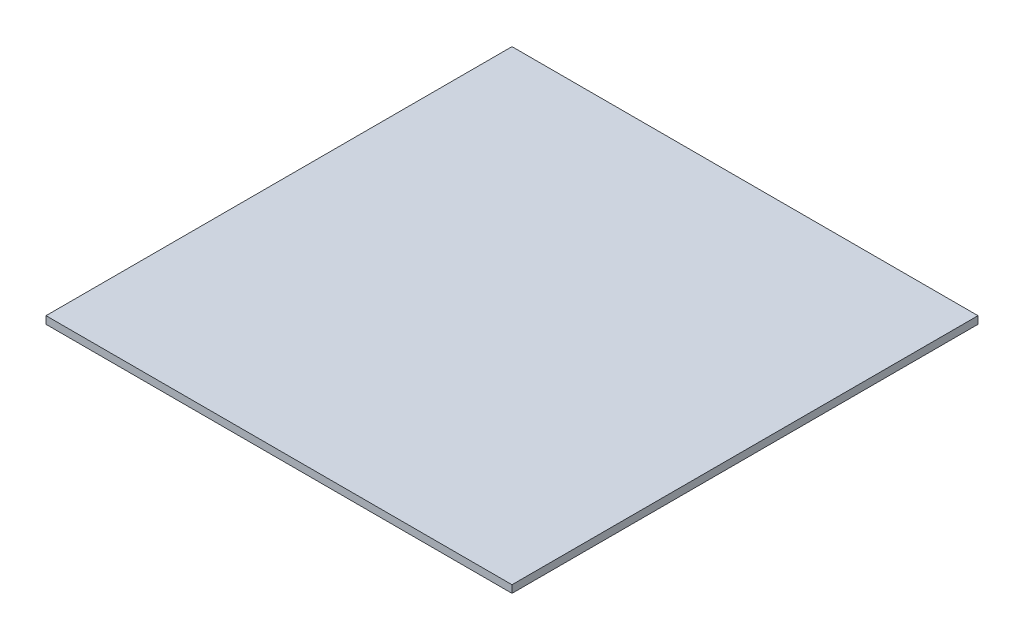
ISO-10303-21;
HEADER;
FILE_DESCRIPTION(('STEP AP214'),'2;1');
FILE_NAME('part.step','',(''),(''),'','','');
FILE_SCHEMA(('AUTOMOTIVE_DESIGN { 1 0 10303 214 1 1 1 1 }'));
ENDSEC;
DATA;
#1=APPLICATION_CONTEXT('core data for automotive mechanical design processes');
#2=APPLICATION_PROTOCOL_DEFINITION('international standard','automotive_design',2000,#1);
#3=PRODUCT_CONTEXT('',#1,'mechanical');
#4=PRODUCT('Part','Part','',(#3));
#5=PRODUCT_RELATED_PRODUCT_CATEGORY('part','',(#4));
#6=PRODUCT_DEFINITION_FORMATION('','',#4);
#7=PRODUCT_DEFINITION_CONTEXT('part definition',#1,'design');
#8=PRODUCT_DEFINITION('design','',#6,#7);
#9=PRODUCT_DEFINITION_SHAPE('','',#8);
#10=(LENGTH_UNIT() NAMED_UNIT(*) SI_UNIT(.MILLI.,.METRE.));
#11=(NAMED_UNIT(*) PLANE_ANGLE_UNIT() SI_UNIT($,.RADIAN.));
#12=(NAMED_UNIT(*) SI_UNIT($,.STERADIAN.) SOLID_ANGLE_UNIT());
#13=UNCERTAINTY_MEASURE_WITH_UNIT(LENGTH_MEASURE(1.E-05),#10,'distance_accuracy_value','');
#14=(GEOMETRIC_REPRESENTATION_CONTEXT(3) GLOBAL_UNCERTAINTY_ASSIGNED_CONTEXT((#13)) GLOBAL_UNIT_ASSIGNED_CONTEXT((#10,
#11,#12)) REPRESENTATION_CONTEXT('',''));
#15=CARTESIAN_POINT('',(0.,0.,0.));
#16=DIRECTION('',(0.,0.,1.));
#17=DIRECTION('',(1.,0.,0.));
#18=AXIS2_PLACEMENT_3D('',#15,#16,#17);
#19=CARTESIAN_POINT('',(1.55,0.,-1.55));
#20=DIRECTION('',(0.,-1.,0.));
#21=DIRECTION('',(0.,0.,-1.));
#22=AXIS2_PLACEMENT_3D('',#19,#20,#21);
#23=PLANE('',#22);
#24=DIRECTION('',(0.,0.,-1.));
#25=VECTOR('',#24,1.);
#26=CARTESIAN_POINT('',(-1.55,0.,1.55));
#27=LINE('',#26,#25);
#28=CARTESIAN_POINT('',(-1.55,0.,1.55));
#29=VERTEX_POINT('',#28);
#30=CARTESIAN_POINT('',(-1.55,0.,-1.55));
#31=VERTEX_POINT('',#30);
#32=EDGE_CURVE('E19',#29,#31,#27,.T.);
#33=ORIENTED_EDGE('',*,*,#32,.T.);
#34=DIRECTION('',(1.,0.,0.));
#35=VECTOR('',#34,1.);
#36=CARTESIAN_POINT('',(-1.55,0.,-1.55));
#37=LINE('',#36,#35);
#38=CARTESIAN_POINT('',(1.55,0.,-1.55));
#39=VERTEX_POINT('',#38);
#40=EDGE_CURVE('E54',#31,#39,#37,.T.);
#41=ORIENTED_EDGE('',*,*,#40,.T.);
#42=DIRECTION('',(0.,0.,1.));
#43=VECTOR('',#42,1.);
#44=CARTESIAN_POINT('',(1.55,0.,1.55));
#45=LINE('',#44,#43);
#46=CARTESIAN_POINT('',(1.55,0.,1.55));
#47=VERTEX_POINT('',#46);
#48=EDGE_CURVE('E75',#39,#47,#45,.T.);
#49=ORIENTED_EDGE('',*,*,#48,.T.);
#50=DIRECTION('',(-1.,0.,0.));
#51=VECTOR('',#50,1.);
#52=CARTESIAN_POINT('',(-1.55,0.,1.55));
#53=LINE('',#52,#51);
#54=EDGE_CURVE('E57',#47,#29,#53,.T.);
#55=ORIENTED_EDGE('',*,*,#54,.T.);
#56=EDGE_LOOP('',(#33,#41,#49,#55));
#57=FACE_BOUND('',#56,.T.);
#58=ADVANCED_FACE('F16',(#57),#23,.T.);
#59=CARTESIAN_POINT('',(-1.55,500000.,1.55));
#60=DIRECTION('',(1.,0.,0.));
#61=DIRECTION('',(0.,0.,-1.));
#62=AXIS2_PLACEMENT_3D('',#59,#60,#61);
#63=PLANE('',#62);
#64=ORIENTED_EDGE('',*,*,#32,.F.);
#65=DIRECTION('',(0.,1.,0.));
#66=VECTOR('',#65,1.);
#67=CARTESIAN_POINT('',(-1.55,500000.,1.55));
#68=LINE('',#67,#66);
#69=CARTESIAN_POINT('',(-1.55,0.0500000000332193,1.55));
#70=VERTEX_POINT('',#69);
#71=EDGE_CURVE('E79',#29,#70,#68,.T.);
#72=ORIENTED_EDGE('',*,*,#71,.T.);
#73=DIRECTION('',(0.,0.,-1.));
#74=VECTOR('',#73,1.);
#75=CARTESIAN_POINT('',(-1.55,0.05,-2.5));
#76=LINE('',#75,#74);
#77=CARTESIAN_POINT('',(-1.55,0.0500000000332193,-1.55));
#78=VERTEX_POINT('',#77);
#79=EDGE_CURVE('E72',#70,#78,#76,.T.);
#80=ORIENTED_EDGE('',*,*,#79,.T.);
#81=DIRECTION('',(0.,1.,0.));
#82=VECTOR('',#81,1.);
#83=CARTESIAN_POINT('',(-1.55,500000.,-1.55));
#84=LINE('',#83,#82);
#85=EDGE_CURVE('E62',#78,#31,#84,.F.);
#86=ORIENTED_EDGE('',*,*,#85,.T.);
#87=EDGE_LOOP('',(#64,#72,#80,#86));
#88=FACE_BOUND('',#87,.T.);
#89=ADVANCED_FACE('F71',(#88),#63,.F.);
#90=CARTESIAN_POINT('',(-1.55,500000.,-1.55));
#91=DIRECTION('',(0.,0.,1.));
#92=DIRECTION('',(1.,0.,0.));
#93=AXIS2_PLACEMENT_3D('',#90,#91,#92);
#94=PLANE('',#93);
#95=ORIENTED_EDGE('',*,*,#40,.F.);
#96=ORIENTED_EDGE('',*,*,#85,.F.);
#97=DIRECTION('',(1.,0.,0.));
#98=VECTOR('',#97,1.);
#99=CARTESIAN_POINT('',(2.5,0.05,-1.55));
#100=LINE('',#99,#98);
#101=CARTESIAN_POINT('',(1.55,0.0500000000332193,-1.55));
#102=VERTEX_POINT('',#101);
#103=EDGE_CURVE('E82',#78,#102,#100,.T.);
#104=ORIENTED_EDGE('',*,*,#103,.T.);
#105=DIRECTION('',(0.,1.,0.));
#106=VECTOR('',#105,1.);
#107=CARTESIAN_POINT('',(1.55,500000.,-1.55));
#108=LINE('',#107,#106);
#109=EDGE_CURVE('E68',#102,#39,#108,.F.);
#110=ORIENTED_EDGE('',*,*,#109,.T.);
#111=EDGE_LOOP('',(#95,#96,#104,#110));
#112=FACE_BOUND('',#111,.T.);
#113=ADVANCED_FACE('F65',(#112),#94,.F.);
#114=CARTESIAN_POINT('',(1.55,500000.,1.55));
#115=DIRECTION('',(-1.,0.,0.));
#116=DIRECTION('',(0.,0.,1.));
#117=AXIS2_PLACEMENT_3D('',#114,#115,#116);
#118=PLANE('',#117);
#119=ORIENTED_EDGE('',*,*,#48,.F.);
#120=ORIENTED_EDGE('',*,*,#109,.F.);
#121=DIRECTION('',(0.,0.,-1.));
#122=VECTOR('',#121,1.);
#123=CARTESIAN_POINT('',(1.55,0.05,-2.5));
#124=LINE('',#123,#122);
#125=CARTESIAN_POINT('',(1.55,0.0500000000332193,1.55));
#126=VERTEX_POINT('',#125);
#127=EDGE_CURVE('E25',#102,#126,#124,.F.);
#128=ORIENTED_EDGE('',*,*,#127,.T.);
#129=DIRECTION('',(0.,1.,0.));
#130=VECTOR('',#129,1.);
#131=CARTESIAN_POINT('',(1.55,500000.,1.55));
#132=LINE('',#131,#130);
#133=EDGE_CURVE('E33',#126,#47,#132,.F.);
#134=ORIENTED_EDGE('',*,*,#133,.T.);
#135=EDGE_LOOP('',(#119,#120,#128,#134));
#136=FACE_BOUND('',#135,.T.);
#137=ADVANCED_FACE('F87',(#136),#118,.F.);
#138=CARTESIAN_POINT('',(-1.55,500000.,1.55));
#139=DIRECTION('',(0.,0.,-1.));
#140=DIRECTION('',(-1.,0.,0.));
#141=AXIS2_PLACEMENT_3D('',#138,#139,#140);
#142=PLANE('',#141);
#143=ORIENTED_EDGE('',*,*,#54,.F.);
#144=ORIENTED_EDGE('',*,*,#133,.F.);
#145=DIRECTION('',(1.,0.,0.));
#146=VECTOR('',#145,1.);
#147=CARTESIAN_POINT('',(2.5,0.05,1.55));
#148=LINE('',#147,#146);
#149=EDGE_CURVE('E11',#126,#70,#148,.F.);
#150=ORIENTED_EDGE('',*,*,#149,.T.);
#151=ORIENTED_EDGE('',*,*,#71,.F.);
#152=EDGE_LOOP('',(#143,#144,#150,#151));
#153=FACE_BOUND('',#152,.T.);
#154=ADVANCED_FACE('F90',(#153),#142,.F.);
#155=CARTESIAN_POINT('',(2.5,0.05,-2.5));
#156=DIRECTION('',(0.,-1.,0.));
#157=DIRECTION('',(0.,0.,-1.));
#158=AXIS2_PLACEMENT_3D('',#155,#156,#157);
#159=PLANE('',#158);
#160=ORIENTED_EDGE('',*,*,#127,.F.);
#161=ORIENTED_EDGE('',*,*,#103,.F.);
#162=ORIENTED_EDGE('',*,*,#79,.F.);
#163=ORIENTED_EDGE('',*,*,#149,.F.);
#164=EDGE_LOOP('',(#160,#161,#162,#163));
#165=FACE_BOUND('',#164,.T.);
#166=ADVANCED_FACE('F89',(#165),#159,.F.);
#167=CLOSED_SHELL('',(#58,#89,#113,#137,#154,#166));
#168=MANIFOLD_SOLID_BREP('B1',#167);
#169=ADVANCED_BREP_SHAPE_REPRESENTATION('',(#18,#168),#14);
#170=SHAPE_DEFINITION_REPRESENTATION(#9,#169);
ENDSEC;
END-ISO-10303-21;
